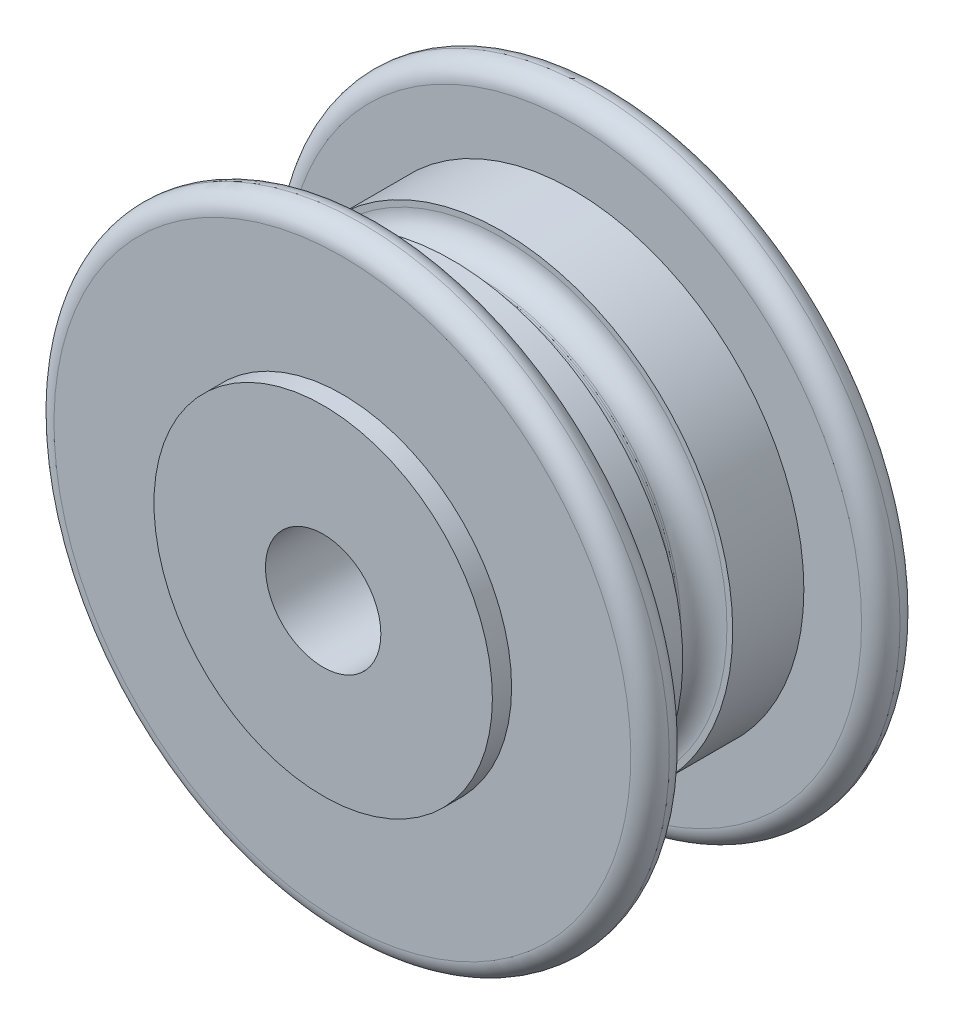
ISO-10303-21;
HEADER;
FILE_DESCRIPTION(('STEP AP214'),'2;1');
FILE_NAME('part.step','',(''),(''),'','','');
FILE_SCHEMA(('AUTOMOTIVE_DESIGN { 1 0 10303 214 1 1 1 1 }'));
ENDSEC;
DATA;
#1=APPLICATION_CONTEXT('core data for automotive mechanical design processes');
#2=APPLICATION_PROTOCOL_DEFINITION('international standard','automotive_design',2000,#1);
#3=PRODUCT_CONTEXT('',#1,'mechanical');
#4=PRODUCT('Part','Part','',(#3));
#5=PRODUCT_RELATED_PRODUCT_CATEGORY('part','',(#4));
#6=PRODUCT_DEFINITION_FORMATION('','',#4);
#7=PRODUCT_DEFINITION_CONTEXT('part definition',#1,'design');
#8=PRODUCT_DEFINITION('design','',#6,#7);
#9=PRODUCT_DEFINITION_SHAPE('','',#8);
#10=(LENGTH_UNIT() NAMED_UNIT(*) SI_UNIT(.MILLI.,.METRE.));
#11=(NAMED_UNIT(*) PLANE_ANGLE_UNIT() SI_UNIT($,.RADIAN.));
#12=(NAMED_UNIT(*) SI_UNIT($,.STERADIAN.) SOLID_ANGLE_UNIT());
#13=UNCERTAINTY_MEASURE_WITH_UNIT(LENGTH_MEASURE(1.E-05),#10,'distance_accuracy_value','');
#14=(GEOMETRIC_REPRESENTATION_CONTEXT(3) GLOBAL_UNCERTAINTY_ASSIGNED_CONTEXT((#13)) GLOBAL_UNIT_ASSIGNED_CONTEXT((#10,
#11,#12)) REPRESENTATION_CONTEXT('',''));
#15=CARTESIAN_POINT('',(0.,0.,0.));
#16=DIRECTION('',(0.,0.,1.));
#17=DIRECTION('',(1.,0.,0.));
#18=AXIS2_PLACEMENT_3D('',#15,#16,#17);
#19=CARTESIAN_POINT('',(166.76725536164,186.976268462502,227.081353367085));
#20=DIRECTION('',(0.,0.,1.));
#21=DIRECTION('',(1.,0.,0.));
#22=AXIS2_PLACEMENT_3D('',#19,#20,#21);
#23=PLANE('',#22);
#24=CARTESIAN_POINT('',(166.76725536164,186.976268462502,227.081353367085));
#25=DIRECTION('',(0.,0.,1.));
#26=DIRECTION('',(1.,0.,0.));
#27=AXIS2_PLACEMENT_3D('',#24,#25,#26);
#28=CIRCLE('',#27,150.);
#29=CARTESIAN_POINT('',(316.76725536164,186.976268462502,227.081353367085));
#30=VERTEX_POINT('',#29);
#31=EDGE_CURVE('E51',#30,#30,#28,.T.);
#32=ORIENTED_EDGE('',*,*,#31,.T.);
#33=EDGE_LOOP('',(#32));
#34=FACE_BOUND('',#33,.T.);
#35=CARTESIAN_POINT('',(166.76725536164,186.976268462502,227.081353367085));
#36=DIRECTION('',(0.,0.,1.));
#37=DIRECTION('',(1.,0.,0.));
#38=AXIS2_PLACEMENT_3D('',#35,#36,#37);
#39=CIRCLE('',#38,120.);
#40=CARTESIAN_POINT('',(286.76725536164,186.976268462502,227.081353367085));
#41=VERTEX_POINT('',#40);
#42=EDGE_CURVE('E64',#41,#41,#39,.T.);
#43=ORIENTED_EDGE('',*,*,#42,.F.);
#44=EDGE_LOOP('',(#43));
#45=FACE_BOUND('',#44,.T.);
#46=ADVANCED_FACE('F39',(#34,#45),#23,.T.);
#47=CARTESIAN_POINT('',(166.76725536164,186.976268462502,207.081353367085));
#48=DIRECTION('',(0.,0.,1.));
#49=DIRECTION('',(1.,0.,0.));
#50=AXIS2_PLACEMENT_3D('',#47,#48,#49);
#51=PLANE('',#50);
#52=CARTESIAN_POINT('',(166.76725536164,186.976268462502,207.081353367085));
#53=DIRECTION('',(0.,0.,1.));
#54=DIRECTION('',(1.,0.,0.));
#55=AXIS2_PLACEMENT_3D('',#52,#53,#54);
#56=CIRCLE('',#55,150.);
#57=CARTESIAN_POINT('',(316.76725536164,186.976268462502,207.081353367085));
#58=VERTEX_POINT('',#57);
#59=EDGE_CURVE('E60',#58,#58,#56,.F.);
#60=ORIENTED_EDGE('',*,*,#59,.T.);
#61=EDGE_LOOP('',(#60));
#62=FACE_BOUND('',#61,.T.);
#63=CARTESIAN_POINT('',(166.76725536164,186.976268462502,207.081353367085));
#64=DIRECTION('',(0.,0.,-1.));
#65=DIRECTION('',(-1.,0.,0.));
#66=AXIS2_PLACEMENT_3D('',#63,#64,#65);
#67=CIRCLE('',#66,88.);
#68=CARTESIAN_POINT('',(78.7672553616402,186.976268462502,207.081353367085));
#69=VERTEX_POINT('',#68);
#70=EDGE_CURVE('E63',#69,#69,#67,.T.);
#71=ORIENTED_EDGE('',*,*,#70,.F.);
#72=EDGE_LOOP('',(#71));
#73=FACE_BOUND('',#72,.T.);
#74=ADVANCED_FACE('F107',(#62,#73),#51,.F.);
#75=CARTESIAN_POINT('',(166.76725536164,186.976268462502,264.081353367085));
#76=DIRECTION('',(0.,0.,-1.));
#77=DIRECTION('',(-1.,0.,0.));
#78=AXIS2_PLACEMENT_3D('',#75,#76,#77);
#79=CYLINDRICAL_SURFACE('',#78,120.);
#80=CARTESIAN_POINT('',(166.76725536164,186.976268462502,264.081353367085));
#81=DIRECTION('',(0.,0.,1.));
#82=DIRECTION('',(1.,0.,0.));
#83=AXIS2_PLACEMENT_3D('',#80,#81,#82);
#84=CIRCLE('',#83,120.);
#85=CARTESIAN_POINT('',(286.76725536164,186.976268462502,264.081353367085));
#86=VERTEX_POINT('',#85);
#87=EDGE_CURVE('E67',#86,#86,#84,.T.);
#88=ORIENTED_EDGE('',*,*,#87,.F.);
#89=EDGE_LOOP('',(#88));
#90=FACE_BOUND('',#89,.T.);
#91=ORIENTED_EDGE('',*,*,#42,.T.);
#92=EDGE_LOOP('',(#91));
#93=FACE_BOUND('',#92,.T.);
#94=ADVANCED_FACE('F114',(#90,#93),#79,.T.);
#95=CARTESIAN_POINT('',(166.76725536164,186.976268462502,264.081353367085));
#96=DIRECTION('',(0.,0.,1.));
#97=DIRECTION('',(1.,0.,0.));
#98=AXIS2_PLACEMENT_3D('',#95,#96,#97);
#99=PLANE('',#98);
#100=CARTESIAN_POINT('',(166.76725536164,186.976268462502,264.081353367085));
#101=DIRECTION('',(0.,0.,1.));
#102=DIRECTION('',(1.,0.,0.));
#103=AXIS2_PLACEMENT_3D('',#100,#101,#102);
#104=CIRCLE('',#103,117.);
#105=CARTESIAN_POINT('',(283.76725536164,186.976268462502,264.081353367085));
#106=VERTEX_POINT('',#105);
#107=EDGE_CURVE('E11',#106,#106,#104,.F.);
#108=ORIENTED_EDGE('',*,*,#107,.T.);
#109=EDGE_LOOP('',(#108));
#110=FACE_BOUND('',#109,.T.);
#111=ORIENTED_EDGE('',*,*,#87,.T.);
#112=EDGE_LOOP('',(#111));
#113=FACE_BOUND('',#112,.T.);
#114=ADVANCED_FACE('F172',(#110,#113),#99,.T.);
#115=CARTESIAN_POINT('',(166.76725536164,186.976268462502,197.081353367085));
#116=DIRECTION('',(0.,0.,1.));
#117=DIRECTION('',(1.,0.,0.));
#118=AXIS2_PLACEMENT_3D('',#115,#116,#117);
#119=CYLINDRICAL_SURFACE('',#118,88.);
#120=CARTESIAN_POINT('',(166.76725536164,186.976268462502,197.081353367085));
#121=DIRECTION('',(0.,0.,-1.));
#122=DIRECTION('',(-1.,0.,0.));
#123=AXIS2_PLACEMENT_3D('',#120,#121,#122);
#124=CIRCLE('',#123,88.);
#125=CARTESIAN_POINT('',(78.7672553616402,186.976268462502,197.081353367085));
#126=VERTEX_POINT('',#125);
#127=EDGE_CURVE('E70',#126,#126,#124,.T.);
#128=ORIENTED_EDGE('',*,*,#127,.F.);
#129=EDGE_LOOP('',(#128));
#130=FACE_BOUND('',#129,.T.);
#131=ORIENTED_EDGE('',*,*,#70,.T.);
#132=EDGE_LOOP('',(#131));
#133=FACE_BOUND('',#132,.T.);
#134=ADVANCED_FACE('F104',(#130,#133),#119,.T.);
#135=CARTESIAN_POINT('',(166.76725536164,186.976268462502,197.081353367085));
#136=DIRECTION('',(0.,0.,-1.));
#137=DIRECTION('',(-1.,0.,0.));
#138=AXIS2_PLACEMENT_3D('',#135,#136,#137);
#139=PLANE('',#138);
#140=CARTESIAN_POINT('',(166.76725536164,186.976268462502,197.081353367085));
#141=DIRECTION('',(0.,0.,1.));
#142=DIRECTION('',(1.,0.,0.));
#143=AXIS2_PLACEMENT_3D('',#140,#141,#142);
#144=CIRCLE('',#143,30.);
#145=CARTESIAN_POINT('',(196.76725536164,186.976268462502,197.081353367085));
#146=VERTEX_POINT('',#145);
#147=EDGE_CURVE('E77',#146,#146,#144,.T.);
#148=ORIENTED_EDGE('',*,*,#147,.T.);
#149=EDGE_LOOP('',(#148));
#150=FACE_BOUND('',#149,.T.);
#151=ORIENTED_EDGE('',*,*,#127,.T.);
#152=EDGE_LOOP('',(#151));
#153=FACE_BOUND('',#152,.T.);
#154=ADVANCED_FACE('F96',(#150,#153),#139,.T.);
#155=CARTESIAN_POINT('',(166.76725536164,186.976268462502,277.081353367085));
#156=DIRECTION('',(0.,0.,-1.));
#157=DIRECTION('',(-1.,0.,0.));
#158=AXIS2_PLACEMENT_3D('',#155,#156,#157);
#159=CYLINDRICAL_SURFACE('',#158,105.);
#160=CARTESIAN_POINT('',(166.76725536164,186.976268462502,276.081353367085));
#161=DIRECTION('',(0.,0.,1.));
#162=DIRECTION('',(1.,0.,0.));
#163=AXIS2_PLACEMENT_3D('',#160,#161,#162);
#164=CIRCLE('',#163,105.);
#165=CARTESIAN_POINT('',(61.7672553616402,186.976268462502,276.081353367085));
#166=VERTEX_POINT('',#165);
#167=EDGE_CURVE('E47',#166,#166,#164,.T.);
#168=CARTESIAN_POINT('',(166.76725536164,186.976268462502,277.081353367085));
#169=DIRECTION('',(0.,0.,1.));
#170=DIRECTION('',(1.,0.,0.));
#171=AXIS2_PLACEMENT_3D('',#168,#169,#170);
#172=CIRCLE('',#171,105.);
#173=CARTESIAN_POINT('',(61.7672553616402,186.976268462502,277.081353367085));
#174=VERTEX_POINT('',#173);
#175=EDGE_CURVE('E57',#174,#174,#172,.T.);
#176=CARTESIAN_POINT('',(61.7672553616402,186.976268462502,276.081353367085));
#177=CARTESIAN_POINT('',(61.7672553616402,186.976268462502,276.091770033752));
#178=CARTESIAN_POINT('',(61.7672553616402,186.976268462502,276.102186700419));
#179=CARTESIAN_POINT('',(61.7672553616402,186.976268462502,276.123020033752));
#180=CARTESIAN_POINT('',(61.7672553616402,186.976268462502,276.133436700419));
#181=CARTESIAN_POINT('',(61.7672553616402,186.976268462502,276.154270033752));
#182=CARTESIAN_POINT('',(61.7672553616402,186.976268462502,276.164686700419));
#183=CARTESIAN_POINT('',(61.7672553616402,186.976268462502,276.185520033752));
#184=CARTESIAN_POINT('',(61.7672553616402,186.976268462502,276.195936700419));
#185=CARTESIAN_POINT('',(61.7672553616402,186.976268462502,276.216770033752));
#186=CARTESIAN_POINT('',(61.7672553616402,186.976268462502,276.227186700419));
#187=CARTESIAN_POINT('',(61.7672553616402,186.976268462502,276.248020033752));
#188=CARTESIAN_POINT('',(61.7672553616402,186.976268462502,276.258436700419));
#189=CARTESIAN_POINT('',(61.7672553616402,186.976268462502,276.279270033752));
#190=CARTESIAN_POINT('',(61.7672553616402,186.976268462502,276.289686700419));
#191=CARTESIAN_POINT('',(61.7672553616402,186.976268462502,276.310520033752));
#192=CARTESIAN_POINT('',(61.7672553616402,186.976268462502,276.320936700419));
#193=CARTESIAN_POINT('',(61.7672553616402,186.976268462502,276.341770033752));
#194=CARTESIAN_POINT('',(61.7672553616402,186.976268462502,276.352186700419));
#195=CARTESIAN_POINT('',(61.7672553616402,186.976268462502,276.373020033752));
#196=CARTESIAN_POINT('',(61.7672553616402,186.976268462502,276.383436700419));
#197=CARTESIAN_POINT('',(61.7672553616402,186.976268462502,276.404270033752));
#198=CARTESIAN_POINT('',(61.7672553616402,186.976268462502,276.414686700419));
#199=CARTESIAN_POINT('',(61.7672553616402,186.976268462502,276.435520033752));
#200=CARTESIAN_POINT('',(61.7672553616402,186.976268462502,276.445936700419));
#201=CARTESIAN_POINT('',(61.7672553616402,186.976268462502,276.466770033752));
#202=CARTESIAN_POINT('',(61.7672553616402,186.976268462502,276.477186700419));
#203=CARTESIAN_POINT('',(61.7672553616402,186.976268462502,276.498020033752));
#204=CARTESIAN_POINT('',(61.7672553616402,186.976268462502,276.508436700419));
#205=CARTESIAN_POINT('',(61.7672553616402,186.976268462502,276.529270033752));
#206=CARTESIAN_POINT('',(61.7672553616402,186.976268462502,276.539686700419));
#207=CARTESIAN_POINT('',(61.7672553616402,186.976268462502,276.560520033752));
#208=CARTESIAN_POINT('',(61.7672553616402,186.976268462502,276.570936700419));
#209=CARTESIAN_POINT('',(61.7672553616402,186.976268462502,276.591770033752));
#210=CARTESIAN_POINT('',(61.7672553616402,186.976268462502,276.602186700419));
#211=CARTESIAN_POINT('',(61.7672553616402,186.976268462502,276.623020033752));
#212=CARTESIAN_POINT('',(61.7672553616402,186.976268462502,276.633436700419));
#213=CARTESIAN_POINT('',(61.7672553616402,186.976268462502,276.654270033752));
#214=CARTESIAN_POINT('',(61.7672553616402,186.976268462502,276.664686700419));
#215=CARTESIAN_POINT('',(61.7672553616402,186.976268462502,276.685520033752));
#216=CARTESIAN_POINT('',(61.7672553616402,186.976268462502,276.695936700419));
#217=CARTESIAN_POINT('',(61.7672553616402,186.976268462502,276.716770033752));
#218=CARTESIAN_POINT('',(61.7672553616402,186.976268462502,276.727186700419));
#219=CARTESIAN_POINT('',(61.7672553616402,186.976268462502,276.748020033752));
#220=CARTESIAN_POINT('',(61.7672553616402,186.976268462502,276.758436700419));
#221=CARTESIAN_POINT('',(61.7672553616402,186.976268462502,276.779270033752));
#222=CARTESIAN_POINT('',(61.7672553616402,186.976268462502,276.789686700419));
#223=CARTESIAN_POINT('',(61.7672553616402,186.976268462502,276.810520033752));
#224=CARTESIAN_POINT('',(61.7672553616402,186.976268462502,276.820936700419));
#225=CARTESIAN_POINT('',(61.7672553616402,186.976268462502,276.841770033752));
#226=CARTESIAN_POINT('',(61.7672553616402,186.976268462502,276.852186700419));
#227=CARTESIAN_POINT('',(61.7672553616402,186.976268462502,276.873020033752));
#228=CARTESIAN_POINT('',(61.7672553616402,186.976268462502,276.883436700419));
#229=CARTESIAN_POINT('',(61.7672553616402,186.976268462502,276.904270033752));
#230=CARTESIAN_POINT('',(61.7672553616402,186.976268462502,276.914686700419));
#231=CARTESIAN_POINT('',(61.7672553616402,186.976268462502,276.935520033752));
#232=CARTESIAN_POINT('',(61.7672553616402,186.976268462502,276.945936700419));
#233=CARTESIAN_POINT('',(61.7672553616402,186.976268462502,276.966770033752));
#234=CARTESIAN_POINT('',(61.7672553616402,186.976268462502,276.977186700419));
#235=CARTESIAN_POINT('',(61.7672553616402,186.976268462502,276.998020033752));
#236=CARTESIAN_POINT('',(61.7672553616402,186.976268462502,277.008436700419));
#237=CARTESIAN_POINT('',(61.7672553616402,186.976268462502,277.029270033752));
#238=CARTESIAN_POINT('',(61.7672553616402,186.976268462502,277.039686700419));
#239=CARTESIAN_POINT('',(61.7672553616402,186.976268462502,277.060520033752));
#240=CARTESIAN_POINT('',(61.7672553616402,186.976268462502,277.070936700419));
#241=CARTESIAN_POINT('',(61.7672553616402,186.976268462502,277.081353367085));
#242=B_SPLINE_CURVE_WITH_KNOTS('',3,(#176,#177,#178,#179,#180,#181,#182,#183,#184,#185,#186,
#187,#188,#189,#190,#191,#192,#193,#194,#195,#196,#197,#198,#199,#200,#201,#202,#203,#204,#205,
#206,#207,#208,#209,#210,#211,#212,#213,#214,#215,#216,#217,#218,#219,#220,#221,#222,#223,#224,
#225,#226,#227,#228,#229,#230,#231,#232,#233,#234,#235,#236,#237,#238,#239,#240,#241),
.UNSPECIFIED.,.F.,.F.,(4,2,2,2,2,2,2,2,2,2,2,2,2,2,2,2,2,2,2,2,2,2,2,2,2,2,2,2,2,2,2,2,4),(0.,
0.0312500000000382,0.0625000000000209,0.0937500000000036,0.125000000000042,0.156250000000024,
0.187500000000007,0.218750000000045,0.250000000000028,0.281250000000011,0.312500000000049,
0.343750000000032,0.375000000000014,0.406250000000052,0.437500000000035,0.468750000000018,0.5,
0.531250000000039,0.562500000000021,0.593750000000004,0.625000000000042,0.656250000000025,
0.687500000000008,0.718750000000046,0.750000000000028,0.781250000000011,0.812500000000049,
0.843750000000032,0.875000000000015,0.906250000000053,0.937500000000036,0.968750000000018,
1.00000000000006),.UNSPECIFIED.);
#243=EDGE_CURVE('BSEAM91',#166,#174,#242,.T.);
#244=ORIENTED_EDGE('',*,*,#167,.T.);
#245=ORIENTED_EDGE('',*,*,#175,.F.);
#246=ORIENTED_EDGE('',*,*,#243,.T.);
#247=ORIENTED_EDGE('',*,*,#243,.F.);
#248=EDGE_LOOP('',(#244,#246,#245,#247));
#249=FACE_BOUND('',#248,.T.);
#250=ADVANCED_FACE('F91',(#249),#159,.T.);
#251=CARTESIAN_POINT('',(166.76725536164,186.976268462502,277.081353367085));
#252=DIRECTION('',(0.,0.,1.));
#253=DIRECTION('',(1.,0.,0.));
#254=AXIS2_PLACEMENT_3D('',#251,#252,#253);
#255=PLANE('',#254);
#256=CARTESIAN_POINT('',(166.76725536164,186.976268462502,277.081353367085));
#257=DIRECTION('',(0.,0.,1.));
#258=DIRECTION('',(1.,0.,0.));
#259=AXIS2_PLACEMENT_3D('',#256,#257,#258);
#260=CIRCLE('',#259,30.);
#261=CARTESIAN_POINT('',(196.76725536164,186.976268462502,277.081353367085));
#262=VERTEX_POINT('',#261);
#263=EDGE_CURVE('E43',#262,#262,#260,.T.);
#264=ORIENTED_EDGE('',*,*,#263,.F.);
#265=EDGE_LOOP('',(#264));
#266=FACE_BOUND('',#265,.T.);
#267=ORIENTED_EDGE('',*,*,#175,.T.);
#268=EDGE_LOOP('',(#267));
#269=FACE_BOUND('',#268,.T.);
#270=ADVANCED_FACE('F87',(#266,#269),#255,.T.);
#271=CARTESIAN_POINT('',(166.76725536164,186.976268462502,217.081353367085));
#272=DIRECTION('',(0.,0.,1.));
#273=DIRECTION('',(1.,0.,0.));
#274=AXIS2_PLACEMENT_3D('',#271,#272,#273);
#275=TOROIDAL_SURFACE('',#274,150.,10.);
#276=ORIENTED_EDGE('',*,*,#31,.F.);
#277=EDGE_LOOP('',(#276));
#278=FACE_BOUND('',#277,.T.);
#279=CARTESIAN_POINT('',(166.76725536164,186.976268462502,217.081353367085));
#280=DIRECTION('',(0.,0.,1.));
#281=DIRECTION('',(1.,0.,0.));
#282=AXIS2_PLACEMENT_3D('',#279,#280,#281);
#283=CIRCLE('',#282,160.);
#284=CARTESIAN_POINT('',(326.76725536164,186.976268462502,217.081353367085));
#285=VERTEX_POINT('',#284);
#286=EDGE_CURVE('E54',#285,#285,#283,.F.);
#287=ORIENTED_EDGE('',*,*,#286,.F.);
#288=EDGE_LOOP('',(#287));
#289=FACE_BOUND('',#288,.T.);
#290=ADVANCED_FACE('F90',(#278,#289),#275,.T.);
#291=CARTESIAN_POINT('',(166.76725536164,186.976268462502,217.081353367085));
#292=DIRECTION('',(0.,0.,1.));
#293=DIRECTION('',(1.,0.,0.));
#294=AXIS2_PLACEMENT_3D('',#291,#292,#293);
#295=TOROIDAL_SURFACE('',#294,150.,10.);
#296=ORIENTED_EDGE('',*,*,#59,.F.);
#297=EDGE_LOOP('',(#296));
#298=FACE_BOUND('',#297,.T.);
#299=ORIENTED_EDGE('',*,*,#286,.T.);
#300=EDGE_LOOP('',(#299));
#301=FACE_BOUND('',#300,.T.);
#302=ADVANCED_FACE('F121',(#298,#301),#295,.T.);
#303=CARTESIAN_POINT('',(166.76725536164,186.976268462502,276.081353367085));
#304=DIRECTION('',(0.,0.,1.));
#305=DIRECTION('',(1.,0.,0.));
#306=AXIS2_PLACEMENT_3D('',#303,#304,#305);
#307=TOROIDAL_SURFACE('',#306,117.,12.);
#308=ORIENTED_EDGE('',*,*,#107,.F.);
#309=EDGE_LOOP('',(#308));
#310=FACE_BOUND('',#309,.T.);
#311=ORIENTED_EDGE('',*,*,#167,.F.);
#312=EDGE_LOOP('',(#311));
#313=FACE_BOUND('',#312,.T.);
#314=ADVANCED_FACE('F41',(#310,#313),#307,.F.);
#315=CARTESIAN_POINT('',(166.76725536164,186.976268462502,197.081353367085));
#316=DIRECTION('',(0.,0.,1.));
#317=DIRECTION('',(1.,0.,0.));
#318=AXIS2_PLACEMENT_3D('',#315,#316,#317);
#319=CYLINDRICAL_SURFACE('',#318,30.);
#320=ORIENTED_EDGE('',*,*,#263,.T.);
#321=EDGE_LOOP('',(#320));
#322=FACE_BOUND('',#321,.T.);
#323=ORIENTED_EDGE('',*,*,#147,.F.);
#324=EDGE_LOOP('',(#323));
#325=FACE_BOUND('',#324,.T.);
#326=ADVANCED_FACE('F84',(#322,#325),#319,.F.);
#327=CLOSED_SHELL('',(#46,#74,#94,#114,#134,#154,#250,#270,#290,#302,#314,#326));
#328=MANIFOLD_SOLID_BREP('B2',#327);
#329=CARTESIAN_POINT('',(166.76725536164,186.976268462502,327.081353367085));
#330=DIRECTION('',(0.,0.,-1.));
#331=DIRECTION('',(-0.980618672123895,0.195926057179666,0.));
#332=AXIS2_PLACEMENT_3D('',#329,#330,#331);
#333=PLANE('',#332);
#334=CARTESIAN_POINT('',(166.76725536164,186.976268462502,327.081353367085));
#335=DIRECTION('',(0.,0.,-1.));
#336=DIRECTION('',(0.,1.,0.));
#337=AXIS2_PLACEMENT_3D('',#334,#335,#336);
#338=CIRCLE('',#337,150.);
#339=CARTESIAN_POINT('',(166.76725536164,336.976268462502,327.081353367085));
#340=VERTEX_POINT('',#339);
#341=EDGE_CURVE('E233',#340,#340,#338,.T.);
#342=ORIENTED_EDGE('',*,*,#341,.T.);
#343=EDGE_LOOP('',(#342));
#344=FACE_BOUND('',#343,.T.);
#345=CARTESIAN_POINT('',(166.76725536164,186.976268462502,327.081353367085));
#346=DIRECTION('',(0.,0.,-1.));
#347=DIRECTION('',(-0.980618672123895,0.195926057179666,0.));
#348=AXIS2_PLACEMENT_3D('',#345,#346,#347);
#349=CIRCLE('',#348,120.);
#350=CARTESIAN_POINT('',(49.0930147067728,210.487395324062,327.081353367085));
#351=VERTEX_POINT('',#350);
#352=EDGE_CURVE('E246',#351,#351,#349,.T.);
#353=ORIENTED_EDGE('',*,*,#352,.F.);
#354=EDGE_LOOP('',(#353));
#355=FACE_BOUND('',#354,.T.);
#356=ADVANCED_FACE('F221',(#344,#355),#333,.T.);
#357=CARTESIAN_POINT('',(166.76725536164,186.976268462502,347.081353367085));
#358=DIRECTION('',(0.,0.,-1.));
#359=DIRECTION('',(-0.980618672123895,0.195926057179666,0.));
#360=AXIS2_PLACEMENT_3D('',#357,#358,#359);
#361=PLANE('',#360);
#362=CARTESIAN_POINT('',(166.76725536164,186.976268462502,347.081353367085));
#363=DIRECTION('',(0.,0.,-1.));
#364=DIRECTION('',(0.,1.,0.));
#365=AXIS2_PLACEMENT_3D('',#362,#363,#364);
#366=CIRCLE('',#365,150.);
#367=CARTESIAN_POINT('',(166.76725536164,336.976268462502,347.081353367085));
#368=VERTEX_POINT('',#367);
#369=EDGE_CURVE('E242',#368,#368,#366,.F.);
#370=ORIENTED_EDGE('',*,*,#369,.T.);
#371=EDGE_LOOP('',(#370));
#372=FACE_BOUND('',#371,.T.);
#373=CARTESIAN_POINT('',(166.76725536164,186.976268462502,347.081353367085));
#374=DIRECTION('',(0.,0.,1.));
#375=DIRECTION('',(0.980618672123895,-0.195926057179666,0.));
#376=AXIS2_PLACEMENT_3D('',#373,#374,#375);
#377=CIRCLE('',#376,88.);
#378=CARTESIAN_POINT('',(253.061698508543,169.734775430691,347.081353367085));
#379=VERTEX_POINT('',#378);
#380=EDGE_CURVE('E245',#379,#379,#377,.T.);
#381=ORIENTED_EDGE('',*,*,#380,.F.);
#382=EDGE_LOOP('',(#381));
#383=FACE_BOUND('',#382,.T.);
#384=ADVANCED_FACE('F289',(#372,#383),#361,.F.);
#385=CARTESIAN_POINT('',(166.76725536164,186.976268462502,290.081353367085));
#386=DIRECTION('',(0.,0.,1.));
#387=DIRECTION('',(0.980618672123895,-0.195926057179666,0.));
#388=AXIS2_PLACEMENT_3D('',#385,#386,#387);
#389=CYLINDRICAL_SURFACE('',#388,120.);
#390=CARTESIAN_POINT('',(166.76725536164,186.976268462502,290.081353367085));
#391=DIRECTION('',(0.,0.,-1.));
#392=DIRECTION('',(-0.980618672123895,0.195926057179666,0.));
#393=AXIS2_PLACEMENT_3D('',#390,#391,#392);
#394=CIRCLE('',#393,120.);
#395=CARTESIAN_POINT('',(49.0930147067728,210.487395324062,290.081353367085));
#396=VERTEX_POINT('',#395);
#397=EDGE_CURVE('E249',#396,#396,#394,.T.);
#398=ORIENTED_EDGE('',*,*,#397,.F.);
#399=EDGE_LOOP('',(#398));
#400=FACE_BOUND('',#399,.T.);
#401=ORIENTED_EDGE('',*,*,#352,.T.);
#402=EDGE_LOOP('',(#401));
#403=FACE_BOUND('',#402,.T.);
#404=ADVANCED_FACE('F296',(#400,#403),#389,.T.);
#405=CARTESIAN_POINT('',(166.76725536164,186.976268462502,290.081353367085));
#406=DIRECTION('',(0.,0.,-1.));
#407=DIRECTION('',(-0.980618672123895,0.195926057179666,0.));
#408=AXIS2_PLACEMENT_3D('',#405,#406,#407);
#409=PLANE('',#408);
#410=CARTESIAN_POINT('',(166.76725536164,186.976268462502,290.081353367085));
#411=DIRECTION('',(0.,0.,-1.));
#412=DIRECTION('',(0.,1.,0.));
#413=AXIS2_PLACEMENT_3D('',#410,#411,#412);
#414=CIRCLE('',#413,117.);
#415=CARTESIAN_POINT('',(166.76725536164,303.976268462502,290.081353367085));
#416=VERTEX_POINT('',#415);
#417=EDGE_CURVE('E38',#416,#416,#414,.F.);
#418=ORIENTED_EDGE('',*,*,#417,.T.);
#419=EDGE_LOOP('',(#418));
#420=FACE_BOUND('',#419,.T.);
#421=ORIENTED_EDGE('',*,*,#397,.T.);
#422=EDGE_LOOP('',(#421));
#423=FACE_BOUND('',#422,.T.);
#424=ADVANCED_FACE('F354',(#420,#423),#409,.T.);
#425=CARTESIAN_POINT('',(166.76725536164,186.976268462502,357.081353367085));
#426=DIRECTION('',(0.,0.,-1.));
#427=DIRECTION('',(-0.980618672123895,0.195926057179666,0.));
#428=AXIS2_PLACEMENT_3D('',#425,#426,#427);
#429=CYLINDRICAL_SURFACE('',#428,88.);
#430=CARTESIAN_POINT('',(166.76725536164,186.976268462502,357.081353367085));
#431=DIRECTION('',(0.,0.,1.));
#432=DIRECTION('',(0.980618672123895,-0.195926057179666,0.));
#433=AXIS2_PLACEMENT_3D('',#430,#431,#432);
#434=CIRCLE('',#433,88.);
#435=CARTESIAN_POINT('',(253.061698508543,169.734775430691,357.081353367085));
#436=VERTEX_POINT('',#435);
#437=EDGE_CURVE('E252',#436,#436,#434,.T.);
#438=ORIENTED_EDGE('',*,*,#437,.F.);
#439=EDGE_LOOP('',(#438));
#440=FACE_BOUND('',#439,.T.);
#441=ORIENTED_EDGE('',*,*,#380,.T.);
#442=EDGE_LOOP('',(#441));
#443=FACE_BOUND('',#442,.T.);
#444=ADVANCED_FACE('F285',(#440,#443),#429,.T.);
#445=CARTESIAN_POINT('',(166.76725536164,186.976268462502,357.081353367085));
#446=DIRECTION('',(0.,0.,1.));
#447=DIRECTION('',(0.980618672123895,-0.195926057179666,0.));
#448=AXIS2_PLACEMENT_3D('',#445,#446,#447);
#449=PLANE('',#448);
#450=CARTESIAN_POINT('',(166.76725536164,186.976268462502,357.081353367085));
#451=DIRECTION('',(0.,0.,1.));
#452=DIRECTION('',(1.,0.,0.));
#453=AXIS2_PLACEMENT_3D('',#450,#451,#452);
#454=CIRCLE('',#453,30.);
#455=CARTESIAN_POINT('',(196.76725536164,186.976268462502,357.081353367085));
#456=VERTEX_POINT('',#455);
#457=EDGE_CURVE('E259',#456,#456,#454,.T.);
#458=ORIENTED_EDGE('',*,*,#457,.F.);
#459=EDGE_LOOP('',(#458));
#460=FACE_BOUND('',#459,.T.);
#461=ORIENTED_EDGE('',*,*,#437,.T.);
#462=EDGE_LOOP('',(#461));
#463=FACE_BOUND('',#462,.T.);
#464=ADVANCED_FACE('F277',(#460,#463),#449,.T.);
#465=CARTESIAN_POINT('',(166.76725536164,186.976268462502,277.081353367085));
#466=DIRECTION('',(0.,0.,1.));
#467=DIRECTION('',(0.980618672123895,-0.195926057179666,0.));
#468=AXIS2_PLACEMENT_3D('',#465,#466,#467);
#469=CYLINDRICAL_SURFACE('',#468,105.);
#470=CARTESIAN_POINT('',(166.76725536164,186.976268462502,278.081353367085));
#471=DIRECTION('',(0.,0.,-1.));
#472=DIRECTION('',(0.,1.,0.));
#473=AXIS2_PLACEMENT_3D('',#470,#471,#472);
#474=CIRCLE('',#473,105.);
#475=CARTESIAN_POINT('',(269.732215934649,166.404032458637,278.081353367085));
#476=VERTEX_POINT('',#475);
#477=EDGE_CURVE('E229',#476,#476,#474,.T.);
#478=CARTESIAN_POINT('',(166.76725536164,186.976268462502,277.081353367085));
#479=DIRECTION('',(0.,0.,-1.));
#480=DIRECTION('',(-0.980618672123895,0.195926057179666,0.));
#481=AXIS2_PLACEMENT_3D('',#478,#479,#480);
#482=CIRCLE('',#481,105.);
#483=CARTESIAN_POINT('',(269.732215934649,166.404032458637,277.081353367085));
#484=VERTEX_POINT('',#483);
#485=EDGE_CURVE('E239',#484,#484,#482,.T.);
#486=CARTESIAN_POINT('',(269.732215934649,166.404032458637,278.081353367085));
#487=CARTESIAN_POINT('',(269.732215934649,166.404032458637,278.070936700419));
#488=CARTESIAN_POINT('',(269.732215934649,166.404032458637,278.060520033752));
#489=CARTESIAN_POINT('',(269.732215934649,166.404032458637,278.039686700419));
#490=CARTESIAN_POINT('',(269.732215934649,166.404032458637,278.029270033752));
#491=CARTESIAN_POINT('',(269.732215934649,166.404032458637,278.008436700419));
#492=CARTESIAN_POINT('',(269.732215934649,166.404032458637,277.998020033752));
#493=CARTESIAN_POINT('',(269.732215934649,166.404032458637,277.977186700419));
#494=CARTESIAN_POINT('',(269.732215934649,166.404032458637,277.966770033752));
#495=CARTESIAN_POINT('',(269.732215934649,166.404032458637,277.945936700419));
#496=CARTESIAN_POINT('',(269.732215934649,166.404032458637,277.935520033752));
#497=CARTESIAN_POINT('',(269.732215934649,166.404032458637,277.914686700419));
#498=CARTESIAN_POINT('',(269.732215934649,166.404032458637,277.904270033752));
#499=CARTESIAN_POINT('',(269.732215934649,166.404032458637,277.883436700419));
#500=CARTESIAN_POINT('',(269.732215934649,166.404032458637,277.873020033752));
#501=CARTESIAN_POINT('',(269.732215934649,166.404032458637,277.852186700419));
#502=CARTESIAN_POINT('',(269.732215934649,166.404032458637,277.841770033752));
#503=CARTESIAN_POINT('',(269.732215934649,166.404032458637,277.820936700419));
#504=CARTESIAN_POINT('',(269.732215934649,166.404032458637,277.810520033752));
#505=CARTESIAN_POINT('',(269.732215934649,166.404032458637,277.789686700419));
#506=CARTESIAN_POINT('',(269.732215934649,166.404032458637,277.779270033752));
#507=CARTESIAN_POINT('',(269.732215934649,166.404032458637,277.758436700419));
#508=CARTESIAN_POINT('',(269.732215934649,166.404032458637,277.748020033752));
#509=CARTESIAN_POINT('',(269.732215934649,166.404032458637,277.727186700419));
#510=CARTESIAN_POINT('',(269.732215934649,166.404032458637,277.716770033752));
#511=CARTESIAN_POINT('',(269.732215934649,166.404032458637,277.695936700419));
#512=CARTESIAN_POINT('',(269.732215934649,166.404032458637,277.685520033752));
#513=CARTESIAN_POINT('',(269.732215934649,166.404032458637,277.664686700419));
#514=CARTESIAN_POINT('',(269.732215934649,166.404032458637,277.654270033752));
#515=CARTESIAN_POINT('',(269.732215934649,166.404032458637,277.633436700419));
#516=CARTESIAN_POINT('',(269.732215934649,166.404032458637,277.623020033752));
#517=CARTESIAN_POINT('',(269.732215934649,166.404032458637,277.602186700419));
#518=CARTESIAN_POINT('',(269.732215934649,166.404032458637,277.591770033752));
#519=CARTESIAN_POINT('',(269.732215934649,166.404032458637,277.570936700419));
#520=CARTESIAN_POINT('',(269.732215934649,166.404032458637,277.560520033752));
#521=CARTESIAN_POINT('',(269.732215934649,166.404032458637,277.539686700419));
#522=CARTESIAN_POINT('',(269.732215934649,166.404032458637,277.529270033752));
#523=CARTESIAN_POINT('',(269.732215934649,166.404032458637,277.508436700419));
#524=CARTESIAN_POINT('',(269.732215934649,166.404032458637,277.498020033752));
#525=CARTESIAN_POINT('',(269.732215934649,166.404032458637,277.477186700419));
#526=CARTESIAN_POINT('',(269.732215934649,166.404032458637,277.466770033752));
#527=CARTESIAN_POINT('',(269.732215934649,166.404032458637,277.445936700419));
#528=CARTESIAN_POINT('',(269.732215934649,166.404032458637,277.435520033752));
#529=CARTESIAN_POINT('',(269.732215934649,166.404032458637,277.414686700419));
#530=CARTESIAN_POINT('',(269.732215934649,166.404032458637,277.404270033752));
#531=CARTESIAN_POINT('',(269.732215934649,166.404032458637,277.383436700419));
#532=CARTESIAN_POINT('',(269.732215934649,166.404032458637,277.373020033752));
#533=CARTESIAN_POINT('',(269.732215934649,166.404032458637,277.352186700419));
#534=CARTESIAN_POINT('',(269.732215934649,166.404032458637,277.341770033752));
#535=CARTESIAN_POINT('',(269.732215934649,166.404032458637,277.320936700419));
#536=CARTESIAN_POINT('',(269.732215934649,166.404032458637,277.310520033752));
#537=CARTESIAN_POINT('',(269.732215934649,166.404032458637,277.289686700419));
#538=CARTESIAN_POINT('',(269.732215934649,166.404032458637,277.279270033752));
#539=CARTESIAN_POINT('',(269.732215934649,166.404032458637,277.258436700419));
#540=CARTESIAN_POINT('',(269.732215934649,166.404032458637,277.248020033752));
#541=CARTESIAN_POINT('',(269.732215934649,166.404032458637,277.227186700419));
#542=CARTESIAN_POINT('',(269.732215934649,166.404032458637,277.216770033752));
#543=CARTESIAN_POINT('',(269.732215934649,166.404032458637,277.195936700419));
#544=CARTESIAN_POINT('',(269.732215934649,166.404032458637,277.185520033752));
#545=CARTESIAN_POINT('',(269.732215934649,166.404032458637,277.164686700419));
#546=CARTESIAN_POINT('',(269.732215934649,166.404032458637,277.154270033752));
#547=CARTESIAN_POINT('',(269.732215934649,166.404032458637,277.133436700419));
#548=CARTESIAN_POINT('',(269.732215934649,166.404032458637,277.123020033752));
#549=CARTESIAN_POINT('',(269.732215934649,166.404032458637,277.102186700419));
#550=CARTESIAN_POINT('',(269.732215934649,166.404032458637,277.091770033752));
#551=CARTESIAN_POINT('',(269.732215934649,166.404032458637,277.081353367085));
#552=B_SPLINE_CURVE_WITH_KNOTS('',3,(#486,#487,#488,#489,#490,#491,#492,#493,#494,#495,#496,
#497,#498,#499,#500,#501,#502,#503,#504,#505,#506,#507,#508,#509,#510,#511,#512,#513,#514,#515,
#516,#517,#518,#519,#520,#521,#522,#523,#524,#525,#526,#527,#528,#529,#530,#531,#532,#533,#534,
#535,#536,#537,#538,#539,#540,#541,#542,#543,#544,#545,#546,#547,#548,#549,#550,#551),
.UNSPECIFIED.,.F.,.F.,(4,2,2,2,2,2,2,2,2,2,2,2,2,2,2,2,2,2,2,2,2,2,2,2,2,2,2,2,2,2,2,2,4),(0.,
0.0312499999999827,0.0624999999999654,0.093749999999948,0.124999999999986,0.156249999999969,
0.187499999999952,0.21874999999999,0.249999999999972,0.281249999999955,0.312499999999993,
0.343749999999976,0.374999999999959,0.406249999999997,0.43749999999998,0.468749999999962,0.5,
0.531249999999983,0.562499999999966,0.593749999999948,0.624999999999987,0.656249999999969,
0.687499999999952,0.71874999999999,0.749999999999973,0.781249999999956,0.812499999999994,
0.843749999999976,0.874999999999959,0.906249999999997,0.93749999999998,0.968749999999963,
0.999999999999945),.UNSPECIFIED.);
#553=EDGE_CURVE('BSEAM272',#476,#484,#552,.T.);
#554=ORIENTED_EDGE('',*,*,#477,.T.);
#555=ORIENTED_EDGE('',*,*,#485,.F.);
#556=ORIENTED_EDGE('',*,*,#553,.T.);
#557=ORIENTED_EDGE('',*,*,#553,.F.);
#558=EDGE_LOOP('',(#554,#556,#555,#557));
#559=FACE_BOUND('',#558,.T.);
#560=ADVANCED_FACE('F272',(#559),#469,.T.);
#561=CARTESIAN_POINT('',(166.76725536164,186.976268462502,277.081353367085));
#562=DIRECTION('',(0.,0.,-1.));
#563=DIRECTION('',(-0.980618672123895,0.195926057179666,0.));
#564=AXIS2_PLACEMENT_3D('',#561,#562,#563);
#565=PLANE('',#564);
#566=CARTESIAN_POINT('',(166.76725536164,186.976268462502,277.081353367085));
#567=DIRECTION('',(0.,0.,-1.));
#568=DIRECTION('',(0.,1.,0.));
#569=AXIS2_PLACEMENT_3D('',#566,#567,#568);
#570=CIRCLE('',#569,30.);
#571=CARTESIAN_POINT('',(166.76725536164,216.976268462502,277.081353367085));
#572=VERTEX_POINT('',#571);
#573=EDGE_CURVE('E225',#572,#572,#570,.T.);
#574=ORIENTED_EDGE('',*,*,#573,.F.);
#575=EDGE_LOOP('',(#574));
#576=FACE_BOUND('',#575,.T.);
#577=ORIENTED_EDGE('',*,*,#485,.T.);
#578=EDGE_LOOP('',(#577));
#579=FACE_BOUND('',#578,.T.);
#580=ADVANCED_FACE('F268',(#576,#579),#565,.T.);
#581=CARTESIAN_POINT('',(166.76725536164,186.976268462502,337.081353367085));
#582=DIRECTION('',(0.,0.,-1.));
#583=DIRECTION('',(0.,1.,0.));
#584=AXIS2_PLACEMENT_3D('',#581,#582,#583);
#585=TOROIDAL_SURFACE('',#584,150.,10.);
#586=ORIENTED_EDGE('',*,*,#341,.F.);
#587=EDGE_LOOP('',(#586));
#588=FACE_BOUND('',#587,.T.);
#589=CARTESIAN_POINT('',(166.76725536164,186.976268462502,337.081353367085));
#590=DIRECTION('',(0.,0.,-1.));
#591=DIRECTION('',(0.,1.,0.));
#592=AXIS2_PLACEMENT_3D('',#589,#590,#591);
#593=CIRCLE('',#592,160.);
#594=CARTESIAN_POINT('',(166.76725536164,346.976268462502,337.081353367085));
#595=VERTEX_POINT('',#594);
#596=EDGE_CURVE('E236',#595,#595,#593,.F.);
#597=ORIENTED_EDGE('',*,*,#596,.F.);
#598=EDGE_LOOP('',(#597));
#599=FACE_BOUND('',#598,.T.);
#600=ADVANCED_FACE('F271',(#588,#599),#585,.T.);
#601=CARTESIAN_POINT('',(166.76725536164,186.976268462502,337.081353367085));
#602=DIRECTION('',(0.,0.,-1.));
#603=DIRECTION('',(0.,1.,0.));
#604=AXIS2_PLACEMENT_3D('',#601,#602,#603);
#605=TOROIDAL_SURFACE('',#604,150.,10.);
#606=ORIENTED_EDGE('',*,*,#369,.F.);
#607=EDGE_LOOP('',(#606));
#608=FACE_BOUND('',#607,.T.);
#609=ORIENTED_EDGE('',*,*,#596,.T.);
#610=EDGE_LOOP('',(#609));
#611=FACE_BOUND('',#610,.T.);
#612=ADVANCED_FACE('F303',(#608,#611),#605,.T.);
#613=CARTESIAN_POINT('',(166.76725536164,186.976268462502,278.081353367085));
#614=DIRECTION('',(0.,0.,-1.));
#615=DIRECTION('',(0.,1.,0.));
#616=AXIS2_PLACEMENT_3D('',#613,#614,#615);
#617=TOROIDAL_SURFACE('',#616,117.,12.);
#618=ORIENTED_EDGE('',*,*,#417,.F.);
#619=EDGE_LOOP('',(#618));
#620=FACE_BOUND('',#619,.T.);
#621=ORIENTED_EDGE('',*,*,#477,.F.);
#622=EDGE_LOOP('',(#621));
#623=FACE_BOUND('',#622,.T.);
#624=ADVANCED_FACE('F223',(#620,#623),#617,.F.);
#625=CARTESIAN_POINT('',(166.76725536164,186.976268462502,197.081353367085));
#626=DIRECTION('',(0.,0.,1.));
#627=DIRECTION('',(1.,0.,0.));
#628=AXIS2_PLACEMENT_3D('',#625,#626,#627);
#629=CYLINDRICAL_SURFACE('',#628,30.);
#630=ORIENTED_EDGE('',*,*,#573,.T.);
#631=EDGE_LOOP('',(#630));
#632=FACE_BOUND('',#631,.T.);
#633=ORIENTED_EDGE('',*,*,#457,.T.);
#634=EDGE_LOOP('',(#633));
#635=FACE_BOUND('',#634,.T.);
#636=ADVANCED_FACE('F266',(#632,#635),#629,.F.);
#637=CLOSED_SHELL('',(#356,#384,#404,#424,#444,#464,#560,#580,#600,#612,#624,#636));
#638=MANIFOLD_SOLID_BREP('B6',#637);
#639=ADVANCED_BREP_SHAPE_REPRESENTATION('',(#18,#328,#638),#14);
#640=SHAPE_DEFINITION_REPRESENTATION(#9,#639);
ENDSEC;
END-ISO-10303-21;
